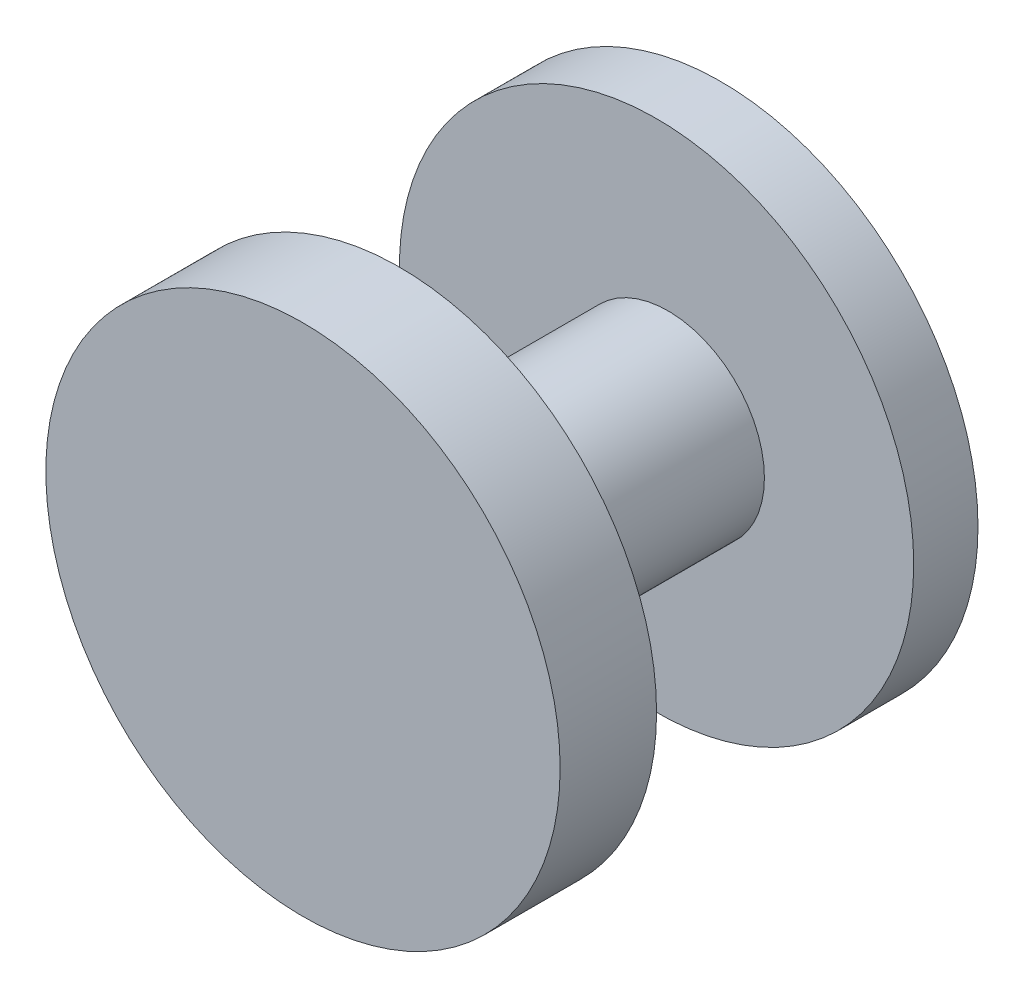
ISO-10303-21;
HEADER;
FILE_DESCRIPTION(('STEP AP214'),'2;1');
FILE_NAME('part.step','',(''),(''),'','','');
FILE_SCHEMA(('AUTOMOTIVE_DESIGN { 1 0 10303 214 1 1 1 1 }'));
ENDSEC;
DATA;
#1=APPLICATION_CONTEXT('core data for automotive mechanical design processes');
#2=APPLICATION_PROTOCOL_DEFINITION('international standard','automotive_design',2000,#1);
#3=PRODUCT_CONTEXT('',#1,'mechanical');
#4=PRODUCT('Part','Part','',(#3));
#5=PRODUCT_RELATED_PRODUCT_CATEGORY('part','',(#4));
#6=PRODUCT_DEFINITION_FORMATION('','',#4);
#7=PRODUCT_DEFINITION_CONTEXT('part definition',#1,'design');
#8=PRODUCT_DEFINITION('design','',#6,#7);
#9=PRODUCT_DEFINITION_SHAPE('','',#8);
#10=(LENGTH_UNIT() NAMED_UNIT(*) SI_UNIT(.MILLI.,.METRE.));
#11=(NAMED_UNIT(*) PLANE_ANGLE_UNIT() SI_UNIT($,.RADIAN.));
#12=(NAMED_UNIT(*) SI_UNIT($,.STERADIAN.) SOLID_ANGLE_UNIT());
#13=UNCERTAINTY_MEASURE_WITH_UNIT(LENGTH_MEASURE(1.E-05),#10,'distance_accuracy_value','');
#14=(GEOMETRIC_REPRESENTATION_CONTEXT(3) GLOBAL_UNCERTAINTY_ASSIGNED_CONTEXT((#13)) GLOBAL_UNIT_ASSIGNED_CONTEXT((#10,
#11,#12)) REPRESENTATION_CONTEXT('',''));
#15=CARTESIAN_POINT('',(0.,0.,0.));
#16=DIRECTION('',(0.,0.,1.));
#17=DIRECTION('',(1.,0.,0.));
#18=AXIS2_PLACEMENT_3D('',#15,#16,#17);
#19=CARTESIAN_POINT('',(0.,0.,2.));
#20=DIRECTION('',(0.,0.,-1.));
#21=DIRECTION('',(-1.,0.,0.));
#22=AXIS2_PLACEMENT_3D('',#19,#20,#21);
#23=CYLINDRICAL_SURFACE('',#22,8.);
#24=CARTESIAN_POINT('',(0.,0.,2.));
#25=DIRECTION('',(0.,0.,1.));
#26=DIRECTION('',(1.,0.,0.));
#27=AXIS2_PLACEMENT_3D('',#24,#25,#26);
#28=CIRCLE('',#27,8.);
#29=CARTESIAN_POINT('',(8.,0.,2.));
#30=VERTEX_POINT('',#29);
#31=EDGE_CURVE('E37',#30,#30,#28,.T.);
#32=ORIENTED_EDGE('',*,*,#31,.F.);
#33=EDGE_LOOP('',(#32));
#34=FACE_BOUND('',#33,.T.);
#35=CARTESIAN_POINT('',(0.,0.,0.));
#36=DIRECTION('',(0.,0.,1.));
#37=DIRECTION('',(1.,0.,0.));
#38=AXIS2_PLACEMENT_3D('',#35,#36,#37);
#39=CIRCLE('',#38,8.);
#40=CARTESIAN_POINT('',(8.,0.,0.));
#41=VERTEX_POINT('',#40);
#42=EDGE_CURVE('E41',#41,#41,#39,.T.);
#43=ORIENTED_EDGE('',*,*,#42,.T.);
#44=EDGE_LOOP('',(#43));
#45=FACE_BOUND('',#44,.T.);
#46=ADVANCED_FACE('F31',(#34,#45),#23,.T.);
#47=CARTESIAN_POINT('',(0.,0.,2.));
#48=DIRECTION('',(0.,0.,1.));
#49=DIRECTION('',(1.,0.,0.));
#50=AXIS2_PLACEMENT_3D('',#47,#48,#49);
#51=PLANE('',#50);
#52=CARTESIAN_POINT('',(0.355322703512684,0.,2.));
#53=DIRECTION('',(0.,0.,1.));
#54=DIRECTION('',(1.,0.,0.));
#55=AXIS2_PLACEMENT_3D('',#52,#53,#54);
#56=CIRCLE('',#55,3.);
#57=CARTESIAN_POINT('',(3.35532270351268,0.,2.));
#58=VERTEX_POINT('',#57);
#59=EDGE_CURVE('E51',#58,#58,#56,.T.);
#60=ORIENTED_EDGE('',*,*,#59,.F.);
#61=EDGE_LOOP('',(#60));
#62=FACE_BOUND('',#61,.T.);
#63=ORIENTED_EDGE('',*,*,#31,.T.);
#64=EDGE_LOOP('',(#63));
#65=FACE_BOUND('',#64,.T.);
#66=ADVANCED_FACE('F81',(#62,#65),#51,.T.);
#67=CARTESIAN_POINT('',(0.,0.,0.));
#68=DIRECTION('',(0.,0.,1.));
#69=DIRECTION('',(1.,0.,0.));
#70=AXIS2_PLACEMENT_3D('',#67,#68,#69);
#71=PLANE('',#70);
#72=CARTESIAN_POINT('',(0.,0.,0.));
#73=DIRECTION('',(0.,0.,1.));
#74=DIRECTION('',(1.,0.,0.));
#75=AXIS2_PLACEMENT_3D('',#72,#73,#74);
#76=CIRCLE('',#75,2.5);
#77=CARTESIAN_POINT('',(2.5,0.,0.));
#78=VERTEX_POINT('',#77);
#79=EDGE_CURVE('E10',#78,#78,#76,.F.);
#80=ORIENTED_EDGE('',*,*,#79,.F.);
#81=EDGE_LOOP('',(#80));
#82=FACE_BOUND('',#81,.T.);
#83=ORIENTED_EDGE('',*,*,#42,.F.);
#84=EDGE_LOOP('',(#83));
#85=FACE_BOUND('',#84,.T.);
#86=ADVANCED_FACE('F86',(#82,#85),#71,.F.);
#87=CARTESIAN_POINT('',(0.,0.,-1.));
#88=DIRECTION('',(0.,0.,1.));
#89=DIRECTION('',(1.,0.,0.));
#90=AXIS2_PLACEMENT_3D('',#87,#88,#89);
#91=CYLINDRICAL_SURFACE('',#90,2.5);
#92=CARTESIAN_POINT('',(0.,0.,-1.));
#93=DIRECTION('',(0.,0.,-1.));
#94=DIRECTION('',(-1.,0.,0.));
#95=AXIS2_PLACEMENT_3D('',#92,#93,#94);
#96=CIRCLE('',#95,2.5);
#97=CARTESIAN_POINT('',(-2.5,0.,-1.));
#98=VERTEX_POINT('',#97);
#99=EDGE_CURVE('E46',#98,#98,#96,.T.);
#100=ORIENTED_EDGE('',*,*,#99,.F.);
#101=EDGE_LOOP('',(#100));
#102=FACE_BOUND('',#101,.T.);
#103=ORIENTED_EDGE('',*,*,#79,.T.);
#104=EDGE_LOOP('',(#103));
#105=FACE_BOUND('',#104,.T.);
#106=ADVANCED_FACE('F93',(#102,#105),#91,.T.);
#107=CARTESIAN_POINT('',(0.,0.,-1.));
#108=DIRECTION('',(0.,0.,-1.));
#109=DIRECTION('',(-1.,0.,0.));
#110=AXIS2_PLACEMENT_3D('',#107,#108,#109);
#111=PLANE('',#110);
#112=ORIENTED_EDGE('',*,*,#99,.T.);
#113=EDGE_LOOP('',(#112));
#114=FACE_BOUND('',#113,.T.);
#115=ADVANCED_FACE('F98',(#114),#111,.T.);
#116=CARTESIAN_POINT('',(0.355322703512684,0.,10.));
#117=DIRECTION('',(0.,0.,-1.));
#118=DIRECTION('',(-1.,0.,0.));
#119=AXIS2_PLACEMENT_3D('',#116,#117,#118);
#120=CYLINDRICAL_SURFACE('',#119,3.);
#121=CARTESIAN_POINT('',(0.355322703512684,0.,10.));
#122=DIRECTION('',(0.,0.,1.));
#123=DIRECTION('',(1.,0.,0.));
#124=AXIS2_PLACEMENT_3D('',#121,#122,#123);
#125=CIRCLE('',#124,3.);
#126=CARTESIAN_POINT('',(3.35532270351268,0.,10.));
#127=VERTEX_POINT('',#126);
#128=EDGE_CURVE('E50',#127,#127,#125,.T.);
#129=ORIENTED_EDGE('',*,*,#128,.F.);
#130=EDGE_LOOP('',(#129));
#131=FACE_BOUND('',#130,.T.);
#132=ORIENTED_EDGE('',*,*,#59,.T.);
#133=EDGE_LOOP('',(#132));
#134=FACE_BOUND('',#133,.T.);
#135=ADVANCED_FACE('F68',(#131,#134),#120,.T.);
#136=CARTESIAN_POINT('',(0.,0.,13.));
#137=DIRECTION('',(0.,0.,-1.));
#138=DIRECTION('',(-1.,0.,0.));
#139=AXIS2_PLACEMENT_3D('',#136,#137,#138);
#140=CYLINDRICAL_SURFACE('',#139,8.);
#141=CARTESIAN_POINT('',(0.,0.,13.));
#142=DIRECTION('',(0.,0.,1.));
#143=DIRECTION('',(1.,0.,0.));
#144=AXIS2_PLACEMENT_3D('',#141,#142,#143);
#145=CIRCLE('',#144,8.);
#146=CARTESIAN_POINT('',(8.,0.,13.));
#147=VERTEX_POINT('',#146);
#148=EDGE_CURVE('E54',#147,#147,#145,.T.);
#149=ORIENTED_EDGE('',*,*,#148,.F.);
#150=EDGE_LOOP('',(#149));
#151=FACE_BOUND('',#150,.T.);
#152=CARTESIAN_POINT('',(0.,0.,10.));
#153=DIRECTION('',(0.,0.,1.));
#154=DIRECTION('',(1.,0.,0.));
#155=AXIS2_PLACEMENT_3D('',#152,#153,#154);
#156=CIRCLE('',#155,8.);
#157=CARTESIAN_POINT('',(8.,0.,10.));
#158=VERTEX_POINT('',#157);
#159=EDGE_CURVE('E57',#158,#158,#156,.T.);
#160=ORIENTED_EDGE('',*,*,#159,.T.);
#161=EDGE_LOOP('',(#160));
#162=FACE_BOUND('',#161,.T.);
#163=ADVANCED_FACE('F65',(#151,#162),#140,.T.);
#164=CARTESIAN_POINT('',(0.,0.,13.));
#165=DIRECTION('',(0.,0.,1.));
#166=DIRECTION('',(1.,0.,0.));
#167=AXIS2_PLACEMENT_3D('',#164,#165,#166);
#168=PLANE('',#167);
#169=ORIENTED_EDGE('',*,*,#148,.T.);
#170=EDGE_LOOP('',(#169));
#171=FACE_BOUND('',#170,.T.);
#172=ADVANCED_FACE('F63',(#171),#168,.T.);
#173=CARTESIAN_POINT('',(0.,0.,10.));
#174=DIRECTION('',(0.,0.,1.));
#175=DIRECTION('',(1.,0.,0.));
#176=AXIS2_PLACEMENT_3D('',#173,#174,#175);
#177=PLANE('',#176);
#178=ORIENTED_EDGE('',*,*,#128,.T.);
#179=EDGE_LOOP('',(#178));
#180=FACE_BOUND('',#179,.T.);
#181=ORIENTED_EDGE('',*,*,#159,.F.);
#182=EDGE_LOOP('',(#181));
#183=FACE_BOUND('',#182,.T.);
#184=ADVANCED_FACE('F72',(#180,#183),#177,.F.);
#185=CLOSED_SHELL('',(#46,#66,#86,#106,#115,#135,#163,#172,#184));
#186=MANIFOLD_SOLID_BREP('B2',#185);
#187=ADVANCED_BREP_SHAPE_REPRESENTATION('',(#18,#186),#14);
#188=SHAPE_DEFINITION_REPRESENTATION(#9,#187);
ENDSEC;
END-ISO-10303-21;
